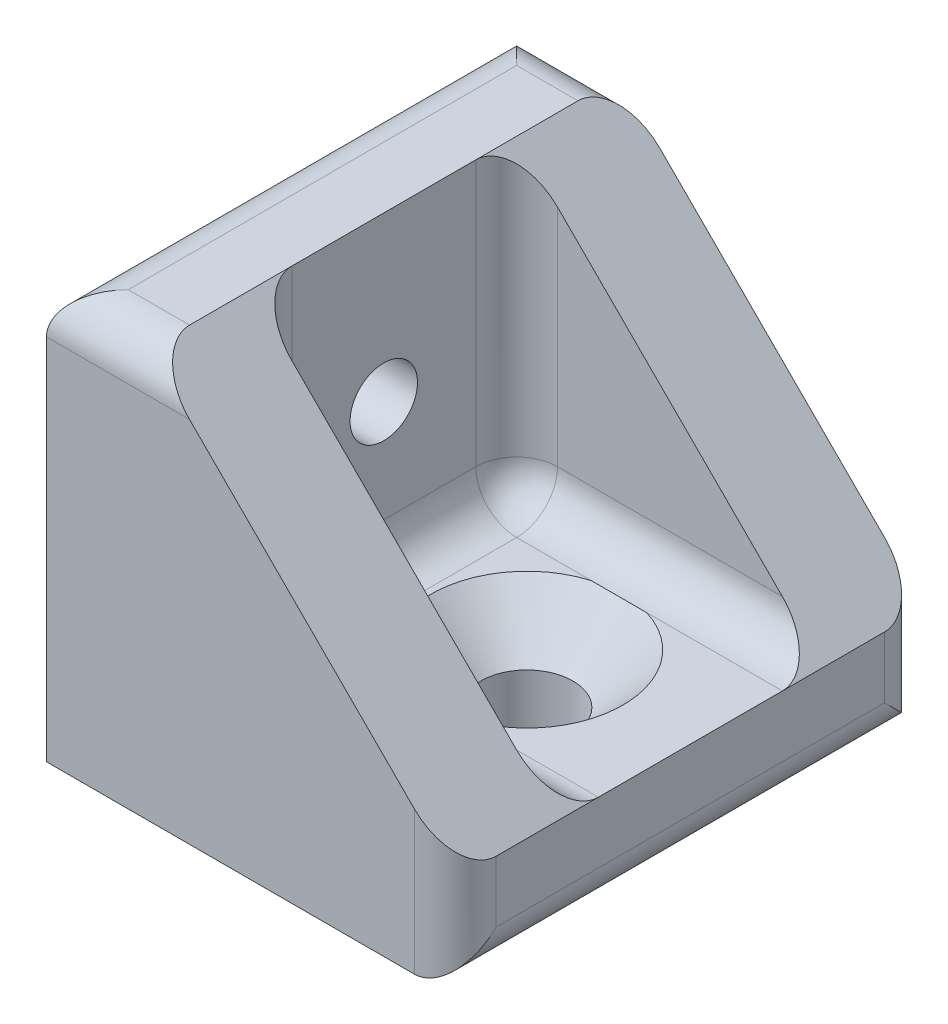
ISO-10303-21;
HEADER;
FILE_DESCRIPTION(('STEP AP214'),'2;1');
FILE_NAME('part.step','',(''),(''),'','','');
FILE_SCHEMA(('AUTOMOTIVE_DESIGN { 1 0 10303 214 1 1 1 1 }'));
ENDSEC;
DATA;
#1=APPLICATION_CONTEXT('core data for automotive mechanical design processes');
#2=APPLICATION_PROTOCOL_DEFINITION('international standard','automotive_design',2000,#1);
#3=PRODUCT_CONTEXT('',#1,'mechanical');
#4=PRODUCT('Part','Part','',(#3));
#5=PRODUCT_RELATED_PRODUCT_CATEGORY('part','',(#4));
#6=PRODUCT_DEFINITION_FORMATION('','',#4);
#7=PRODUCT_DEFINITION_CONTEXT('part definition',#1,'design');
#8=PRODUCT_DEFINITION('design','',#6,#7);
#9=PRODUCT_DEFINITION_SHAPE('','',#8);
#10=(LENGTH_UNIT() NAMED_UNIT(*) SI_UNIT(.MILLI.,.METRE.));
#11=(NAMED_UNIT(*) PLANE_ANGLE_UNIT() SI_UNIT($,.RADIAN.));
#12=(NAMED_UNIT(*) SI_UNIT($,.STERADIAN.) SOLID_ANGLE_UNIT());
#13=UNCERTAINTY_MEASURE_WITH_UNIT(LENGTH_MEASURE(1.E-05),#10,'distance_accuracy_value','');
#14=(GEOMETRIC_REPRESENTATION_CONTEXT(3) GLOBAL_UNCERTAINTY_ASSIGNED_CONTEXT((#13)) GLOBAL_UNIT_ASSIGNED_CONTEXT((#10,
#11,#12)) REPRESENTATION_CONTEXT('',''));
#15=CARTESIAN_POINT('',(0.,0.,0.));
#16=DIRECTION('',(0.,0.,1.));
#17=DIRECTION('',(1.,0.,0.));
#18=AXIS2_PLACEMENT_3D('',#15,#16,#17);
#19=CARTESIAN_POINT('',(20.,5.,-23.));
#20=DIRECTION('',(0.,-1.,0.));
#21=DIRECTION('',(0.,0.,-1.));
#22=AXIS2_PLACEMENT_3D('',#19,#20,#21);
#23=PLANE('',#22);
#24=CARTESIAN_POINT('',(12.,5.,-11.5));
#25=DIRECTION('',(0.,1.,0.));
#26=DIRECTION('',(0.,0.,1.));
#27=AXIS2_PLACEMENT_3D('',#24,#25,#26);
#28=CIRCLE('',#27,4.7);
#29=CARTESIAN_POINT('',(13.3564659966251,5.,-7.));
#30=VERTEX_POINT('',#29);
#31=CARTESIAN_POINT('',(13.356465996625,5.,-16.));
#32=VERTEX_POINT('',#31);
#33=EDGE_CURVE('E177',#30,#32,#28,.T.);
#34=ORIENTED_EDGE('',*,*,#33,.F.);
#35=DIRECTION('',(1.,0.,0.));
#36=VECTOR('',#35,1.);
#37=CARTESIAN_POINT('',(20.,5.,-7.));
#38=LINE('',#37,#36);
#39=CARTESIAN_POINT('',(20.,5.,-7.));
#40=VERTEX_POINT('',#39);
#41=EDGE_CURVE('E174',#30,#40,#38,.T.);
#42=ORIENTED_EDGE('',*,*,#41,.T.);
#43=DIRECTION('',(0.,0.,1.));
#44=VECTOR('',#43,1.);
#45=CARTESIAN_POINT('',(20.,5.,-23.));
#46=LINE('',#45,#44);
#47=CARTESIAN_POINT('',(20.,5.,-16.));
#48=VERTEX_POINT('',#47);
#49=EDGE_CURVE('E294',#48,#40,#46,.T.);
#50=ORIENTED_EDGE('',*,*,#49,.F.);
#51=DIRECTION('',(1.,0.,0.));
#52=VECTOR('',#51,1.);
#53=CARTESIAN_POINT('',(5.,5.,-16.));
#54=LINE('',#53,#52);
#55=EDGE_CURVE('E186',#48,#32,#54,.F.);
#56=ORIENTED_EDGE('',*,*,#55,.T.);
#57=EDGE_LOOP('',(#34,#42,#50,#56));
#58=FACE_BOUND('',#57,.T.);
#59=ADVANCED_FACE('F39',(#58),#23,.F.);
#60=CARTESIAN_POINT('',(10.643534003375,5.,-16.));
#61=VERTEX_POINT('',#60);
#62=CARTESIAN_POINT('',(10.6435340033749,5.,-7.));
#63=VERTEX_POINT('',#62);
#64=EDGE_CURVE('E185',#61,#63,#28,.T.);
#65=ORIENTED_EDGE('',*,*,#64,.F.);
#66=CARTESIAN_POINT('',(7.,5.,-16.));
#67=VERTEX_POINT('',#66);
#68=EDGE_CURVE('E198',#61,#67,#54,.F.);
#69=ORIENTED_EDGE('',*,*,#68,.T.);
#70=DIRECTION('',(0.,0.,1.));
#71=VECTOR('',#70,1.);
#72=CARTESIAN_POINT('',(7.,5.,-5.));
#73=LINE('',#72,#71);
#74=CARTESIAN_POINT('',(7.,5.,-7.));
#75=VERTEX_POINT('',#74);
#76=EDGE_CURVE('E192',#67,#75,#73,.T.);
#77=ORIENTED_EDGE('',*,*,#76,.T.);
#78=EDGE_CURVE('E172',#75,#63,#38,.T.);
#79=ORIENTED_EDGE('',*,*,#78,.T.);
#80=EDGE_LOOP('',(#65,#69,#77,#79));
#81=FACE_BOUND('',#80,.T.);
#82=ADVANCED_FACE('F413',(#81),#23,.F.);
#83=CARTESIAN_POINT('',(5.,20.,-23.));
#84=DIRECTION('',(0.707106781186548,0.707106781186548,0.));
#85=DIRECTION('',(-0.707106781186548,0.707106781186548,0.));
#86=AXIS2_PLACEMENT_3D('',#83,#84,#85);
#87=PLANE('',#86);
#88=DIRECTION('',(-0.707106781186547,0.707106781186547,0.));
#89=VECTOR('',#88,1.);
#90=CARTESIAN_POINT('',(5.,20.,0.));
#91=LINE('',#90,#89);
#92=CARTESIAN_POINT('',(18.,7.,0.));
#93=VERTEX_POINT('',#92);
#94=CARTESIAN_POINT('',(7.,18.,0.));
#95=VERTEX_POINT('',#94);
#96=EDGE_CURVE('E314',#93,#95,#91,.T.);
#97=ORIENTED_EDGE('',*,*,#96,.F.);
#98=CARTESIAN_POINT('',(18.,7.,-2.));
#99=DIRECTION('',(0.707106781186548,0.707106781186548,0.));
#100=DIRECTION('',(0.707106781186548,-0.707106781186548,0.));
#101=AXIS2_PLACEMENT_3D('',#98,#99,#100);
#102=ELLIPSE('',#101,2.82842712474619,2.);
#103=CARTESIAN_POINT('',(20.,5.,-2.));
#104=VERTEX_POINT('',#103);
#105=EDGE_CURVE('E270',#93,#104,#102,.T.);
#106=ORIENTED_EDGE('',*,*,#105,.T.);
#107=DIRECTION('',(0.,0.,1.));
#108=VECTOR('',#107,1.);
#109=CARTESIAN_POINT('',(20.,5.,-23.));
#110=LINE('',#109,#108);
#111=EDGE_CURVE('E315',#40,#104,#110,.T.);
#112=ORIENTED_EDGE('',*,*,#111,.F.);
#113=CARTESIAN_POINT('',(18.,7.,-7.));
#114=DIRECTION('',(0.707106781186548,0.707106781186548,0.));
#115=DIRECTION('',(0.707106781186548,-0.707106781186548,0.));
#116=AXIS2_PLACEMENT_3D('',#113,#114,#115);
#117=ELLIPSE('',#116,2.82842712474619,2.);
#118=CARTESIAN_POINT('',(18.,7.,-5.));
#119=VERTEX_POINT('',#118);
#120=EDGE_CURVE('E193',#40,#119,#117,.F.);
#121=ORIENTED_EDGE('',*,*,#120,.T.);
#122=DIRECTION('',(-0.707106781186548,0.707106781186548,0.));
#123=VECTOR('',#122,1.);
#124=CARTESIAN_POINT('',(5.,20.,-5.));
#125=LINE('',#124,#123);
#126=CARTESIAN_POINT('',(7.,18.,-5.));
#127=VERTEX_POINT('',#126);
#128=EDGE_CURVE('E239',#119,#127,#125,.T.);
#129=ORIENTED_EDGE('',*,*,#128,.T.);
#130=CARTESIAN_POINT('',(7.,18.,-7.));
#131=DIRECTION('',(0.707106781186548,0.707106781186548,0.));
#132=DIRECTION('',(0.707106781186548,-0.707106781186548,0.));
#133=AXIS2_PLACEMENT_3D('',#130,#131,#132);
#134=ELLIPSE('',#133,2.82842712474619,2.);
#135=CARTESIAN_POINT('',(5.,20.,-7.));
#136=VERTEX_POINT('',#135);
#137=EDGE_CURVE('E217',#127,#136,#134,.F.);
#138=ORIENTED_EDGE('',*,*,#137,.T.);
#139=DIRECTION('',(0.,0.,1.));
#140=VECTOR('',#139,1.);
#141=CARTESIAN_POINT('',(5.,20.,-23.));
#142=LINE('',#141,#140);
#143=CARTESIAN_POINT('',(5.,20.,-2.));
#144=VERTEX_POINT('',#143);
#145=EDGE_CURVE('E323',#136,#144,#142,.T.);
#146=ORIENTED_EDGE('',*,*,#145,.T.);
#147=CARTESIAN_POINT('',(7.,18.,-2.));
#148=DIRECTION('',(0.707106781186548,0.707106781186548,0.));
#149=DIRECTION('',(0.707106781186548,-0.707106781186548,0.));
#150=AXIS2_PLACEMENT_3D('',#147,#148,#149);
#151=ELLIPSE('',#150,2.82842712474619,2.);
#152=EDGE_CURVE('E265',#144,#95,#151,.T.);
#153=ORIENTED_EDGE('',*,*,#152,.T.);
#154=EDGE_LOOP('',(#97,#106,#112,#121,#129,#138,#146,#153));
#155=FACE_BOUND('',#154,.T.);
#156=ADVANCED_FACE('F390',(#155),#87,.T.);
#157=CARTESIAN_POINT('',(20.,0.,-23.));
#158=DIRECTION('',(0.,-1.,0.));
#159=DIRECTION('',(0.,0.,-1.));
#160=AXIS2_PLACEMENT_3D('',#157,#158,#159);
#161=PLANE('',#160);
#162=CARTESIAN_POINT('',(12.,0.,-11.5));
#163=DIRECTION('',(0.,1.,0.));
#164=DIRECTION('',(0.,0.,1.));
#165=AXIS2_PLACEMENT_3D('',#162,#163,#164);
#166=CIRCLE('',#165,2.25);
#167=CARTESIAN_POINT('',(12.,0.,-9.25));
#168=VERTEX_POINT('',#167);
#169=EDGE_CURVE('E290',#168,#168,#166,.T.);
#170=ORIENTED_EDGE('',*,*,#169,.T.);
#171=EDGE_LOOP('',(#170));
#172=FACE_BOUND('',#171,.T.);
#173=DIRECTION('',(1.,0.,0.));
#174=VECTOR('',#173,1.);
#175=CARTESIAN_POINT('',(20.,0.,-23.));
#176=LINE('',#175,#174);
#177=CARTESIAN_POINT('',(0.,0.,-23.));
#178=VERTEX_POINT('',#177);
#179=CARTESIAN_POINT('',(18.,0.,-23.));
#180=VERTEX_POINT('',#179);
#181=EDGE_CURVE('E303',#178,#180,#176,.T.);
#182=ORIENTED_EDGE('',*,*,#181,.T.);
#183=DIRECTION('',(0.,0.,1.));
#184=VECTOR('',#183,1.);
#185=CARTESIAN_POINT('',(18.,0.,-23.));
#186=LINE('',#185,#184);
#187=CARTESIAN_POINT('',(18.,0.,0.));
#188=VERTEX_POINT('',#187);
#189=EDGE_CURVE('E48',#180,#188,#186,.T.);
#190=ORIENTED_EDGE('',*,*,#189,.T.);
#191=DIRECTION('',(1.,0.,0.));
#192=VECTOR('',#191,1.);
#193=CARTESIAN_POINT('',(20.,0.,0.));
#194=LINE('',#193,#192);
#195=CARTESIAN_POINT('',(0.,0.,0.));
#196=VERTEX_POINT('',#195);
#197=EDGE_CURVE('E295',#196,#188,#194,.T.);
#198=ORIENTED_EDGE('',*,*,#197,.F.);
#199=DIRECTION('',(0.,0.,1.));
#200=VECTOR('',#199,1.);
#201=CARTESIAN_POINT('',(0.,0.,-23.));
#202=LINE('',#201,#200);
#203=EDGE_CURVE('E319',#178,#196,#202,.T.);
#204=ORIENTED_EDGE('',*,*,#203,.F.);
#205=EDGE_LOOP('',(#182,#190,#198,#204));
#206=FACE_BOUND('',#205,.T.);
#207=ADVANCED_FACE('F376',(#172,#206),#161,.T.);
#208=CARTESIAN_POINT('',(0.,0.,-23.));
#209=DIRECTION('',(-1.,0.,0.));
#210=DIRECTION('',(0.,0.,1.));
#211=AXIS2_PLACEMENT_3D('',#208,#209,#210);
#212=PLANE('',#211);
#213=CARTESIAN_POINT('',(0.,12.,-11.5));
#214=DIRECTION('',(1.,0.,0.));
#215=DIRECTION('',(0.,0.,-1.));
#216=AXIS2_PLACEMENT_3D('',#213,#214,#215);
#217=CIRCLE('',#216,1.65);
#218=CARTESIAN_POINT('',(0.,12.,-13.15));
#219=VERTEX_POINT('',#218);
#220=EDGE_CURVE('E273',#219,#219,#217,.T.);
#221=ORIENTED_EDGE('',*,*,#220,.T.);
#222=EDGE_LOOP('',(#221));
#223=FACE_BOUND('',#222,.T.);
#224=DIRECTION('',(0.,-1.,0.));
#225=VECTOR('',#224,1.);
#226=CARTESIAN_POINT('',(0.,0.,0.));
#227=LINE('',#226,#225);
#228=CARTESIAN_POINT('',(0.,18.,0.));
#229=VERTEX_POINT('',#228);
#230=EDGE_CURVE('E310',#229,#196,#227,.T.);
#231=ORIENTED_EDGE('',*,*,#230,.F.);
#232=DIRECTION('',(0.,0.,1.));
#233=VECTOR('',#232,1.);
#234=CARTESIAN_POINT('',(0.,18.,-23.));
#235=LINE('',#234,#233);
#236=CARTESIAN_POINT('',(0.,18.,-23.));
#237=VERTEX_POINT('',#236);
#238=EDGE_CURVE('E11',#229,#237,#235,.F.);
#239=ORIENTED_EDGE('',*,*,#238,.T.);
#240=DIRECTION('',(0.,-1.,0.));
#241=VECTOR('',#240,1.);
#242=CARTESIAN_POINT('',(0.,0.,-23.));
#243=LINE('',#242,#241);
#244=EDGE_CURVE('E309',#237,#178,#243,.T.);
#245=ORIENTED_EDGE('',*,*,#244,.T.);
#246=ORIENTED_EDGE('',*,*,#203,.T.);
#247=EDGE_LOOP('',(#231,#239,#245,#246));
#248=FACE_BOUND('',#247,.T.);
#249=ADVANCED_FACE('F399',(#223,#248),#212,.T.);
#250=CARTESIAN_POINT('',(0.,20.,-23.));
#251=DIRECTION('',(0.,1.,0.));
#252=DIRECTION('',(0.,0.,1.));
#253=AXIS2_PLACEMENT_3D('',#250,#251,#252);
#254=PLANE('',#253);
#255=CARTESIAN_POINT('',(5.,20.,-21.));
#256=VERTEX_POINT('',#255);
#257=CARTESIAN_POINT('',(5.,20.,-16.));
#258=VERTEX_POINT('',#257);
#259=EDGE_CURVE('E321',#256,#258,#142,.T.);
#260=ORIENTED_EDGE('',*,*,#259,.F.);
#261=DIRECTION('',(-1.,0.,0.));
#262=VECTOR('',#261,1.);
#263=CARTESIAN_POINT('',(0.,20.,-21.));
#264=LINE('',#263,#262);
#265=CARTESIAN_POINT('',(2.,20.,-21.));
#266=VERTEX_POINT('',#265);
#267=EDGE_CURVE('E242',#256,#266,#264,.T.);
#268=ORIENTED_EDGE('',*,*,#267,.T.);
#269=DIRECTION('',(0.,0.,1.));
#270=VECTOR('',#269,1.);
#271=CARTESIAN_POINT('',(2.,20.,-23.));
#272=LINE('',#271,#270);
#273=CARTESIAN_POINT('',(2.,20.,-2.));
#274=VERTEX_POINT('',#273);
#275=EDGE_CURVE('E221',#266,#274,#272,.T.);
#276=ORIENTED_EDGE('',*,*,#275,.T.);
#277=DIRECTION('',(-1.,0.,0.));
#278=VECTOR('',#277,1.);
#279=CARTESIAN_POINT('',(5.,20.,-2.));
#280=LINE('',#279,#278);
#281=EDGE_CURVE('E245',#274,#144,#280,.F.);
#282=ORIENTED_EDGE('',*,*,#281,.T.);
#283=ORIENTED_EDGE('',*,*,#145,.F.);
#284=DIRECTION('',(0.,0.,1.));
#285=VECTOR('',#284,1.);
#286=CARTESIAN_POINT('',(5.,20.,-23.));
#287=LINE('',#286,#285);
#288=EDGE_CURVE('E293',#258,#136,#287,.T.);
#289=ORIENTED_EDGE('',*,*,#288,.F.);
#290=EDGE_LOOP('',(#260,#268,#276,#282,#283,#289));
#291=FACE_BOUND('',#290,.T.);
#292=ADVANCED_FACE('F347',(#291),#254,.T.);
#293=DIRECTION('',(-0.707106781186547,0.707106781186547,0.));
#294=VECTOR('',#293,1.);
#295=CARTESIAN_POINT('',(5.,20.,-23.));
#296=LINE('',#295,#294);
#297=CARTESIAN_POINT('',(18.,7.,-23.));
#298=VERTEX_POINT('',#297);
#299=CARTESIAN_POINT('',(7.,18.,-23.));
#300=VERTEX_POINT('',#299);
#301=EDGE_CURVE('E306',#298,#300,#296,.T.);
#302=ORIENTED_EDGE('',*,*,#301,.T.);
#303=CARTESIAN_POINT('',(7.,18.,-21.));
#304=DIRECTION('',(0.707106781186548,0.707106781186548,0.));
#305=DIRECTION('',(-0.707106781186548,0.707106781186548,0.));
#306=AXIS2_PLACEMENT_3D('',#303,#304,#305);
#307=ELLIPSE('',#306,2.82842712474619,2.);
#308=EDGE_CURVE('E254',#300,#256,#307,.T.);
#309=ORIENTED_EDGE('',*,*,#308,.T.);
#310=ORIENTED_EDGE('',*,*,#259,.T.);
#311=CARTESIAN_POINT('',(7.,18.,-16.));
#312=DIRECTION('',(0.707106781186548,0.707106781186548,0.));
#313=DIRECTION('',(-0.707106781186548,0.707106781186548,0.));
#314=AXIS2_PLACEMENT_3D('',#311,#312,#313);
#315=ELLIPSE('',#314,2.82842712474619,2.);
#316=CARTESIAN_POINT('',(7.,18.,-18.));
#317=VERTEX_POINT('',#316);
#318=EDGE_CURVE('E208',#258,#317,#315,.F.);
#319=ORIENTED_EDGE('',*,*,#318,.T.);
#320=DIRECTION('',(-0.707106781186548,0.707106781186548,0.));
#321=VECTOR('',#320,1.);
#322=CARTESIAN_POINT('',(5.,20.,-18.));
#323=LINE('',#322,#321);
#324=CARTESIAN_POINT('',(18.,7.,-18.));
#325=VERTEX_POINT('',#324);
#326=EDGE_CURVE('E296',#325,#317,#323,.T.);
#327=ORIENTED_EDGE('',*,*,#326,.F.);
#328=CARTESIAN_POINT('',(18.,7.,-16.));
#329=DIRECTION('',(0.707106781186548,0.707106781186548,0.));
#330=DIRECTION('',(-0.707106781186548,0.707106781186548,0.));
#331=AXIS2_PLACEMENT_3D('',#328,#329,#330);
#332=ELLIPSE('',#331,2.82842712474619,2.);
#333=EDGE_CURVE('E213',#325,#48,#332,.F.);
#334=ORIENTED_EDGE('',*,*,#333,.T.);
#335=CARTESIAN_POINT('',(20.,5.,-21.));
#336=VERTEX_POINT('',#335);
#337=EDGE_CURVE('E322',#336,#48,#110,.T.);
#338=ORIENTED_EDGE('',*,*,#337,.F.);
#339=CARTESIAN_POINT('',(18.,7.,-21.));
#340=DIRECTION('',(0.707106781186548,0.707106781186548,0.));
#341=DIRECTION('',(-0.707106781186548,0.707106781186548,0.));
#342=AXIS2_PLACEMENT_3D('',#339,#340,#341);
#343=ELLIPSE('',#342,2.82842712474619,2.);
#344=EDGE_CURVE('E252',#336,#298,#343,.T.);
#345=ORIENTED_EDGE('',*,*,#344,.T.);
#346=EDGE_LOOP('',(#302,#309,#310,#319,#327,#334,#338,#345));
#347=FACE_BOUND('',#346,.T.);
#348=ADVANCED_FACE('F353',(#347),#87,.T.);
#349=CARTESIAN_POINT('',(20.,5.,-23.));
#350=DIRECTION('',(1.,0.,0.));
#351=DIRECTION('',(0.,0.,-1.));
#352=AXIS2_PLACEMENT_3D('',#349,#350,#351);
#353=PLANE('',#352);
#354=DIRECTION('',(0.,0.,1.));
#355=VECTOR('',#354,1.);
#356=CARTESIAN_POINT('',(20.,2.,-23.));
#357=LINE('',#356,#355);
#358=CARTESIAN_POINT('',(20.,2.,-2.));
#359=VERTEX_POINT('',#358);
#360=CARTESIAN_POINT('',(20.,2.,-21.));
#361=VERTEX_POINT('',#360);
#362=EDGE_CURVE('E253',#359,#361,#357,.F.);
#363=ORIENTED_EDGE('',*,*,#362,.T.);
#364=DIRECTION('',(0.,1.,0.));
#365=VECTOR('',#364,1.);
#366=CARTESIAN_POINT('',(20.,5.,-21.));
#367=LINE('',#366,#365);
#368=EDGE_CURVE('E258',#361,#336,#367,.T.);
#369=ORIENTED_EDGE('',*,*,#368,.T.);
#370=ORIENTED_EDGE('',*,*,#337,.T.);
#371=ORIENTED_EDGE('',*,*,#49,.T.);
#372=ORIENTED_EDGE('',*,*,#111,.T.);
#373=DIRECTION('',(0.,1.,0.));
#374=VECTOR('',#373,1.);
#375=CARTESIAN_POINT('',(20.,0.,-2.));
#376=LINE('',#375,#374);
#377=EDGE_CURVE('E256',#104,#359,#376,.F.);
#378=ORIENTED_EDGE('',*,*,#377,.T.);
#379=EDGE_LOOP('',(#363,#369,#370,#371,#372,#378));
#380=FACE_BOUND('',#379,.T.);
#381=ADVANCED_FACE('F362',(#380),#353,.T.);
#382=CARTESIAN_POINT('',(0.,0.,-23.));
#383=DIRECTION('',(0.,0.,-1.));
#384=DIRECTION('',(-1.,0.,0.));
#385=AXIS2_PLACEMENT_3D('',#382,#383,#384);
#386=PLANE('',#385);
#387=ORIENTED_EDGE('',*,*,#244,.F.);
#388=DIRECTION('',(-1.,0.,0.));
#389=VECTOR('',#388,1.);
#390=CARTESIAN_POINT('',(0.,18.,-23.));
#391=LINE('',#390,#389);
#392=EDGE_CURVE('E248',#237,#300,#391,.F.);
#393=ORIENTED_EDGE('',*,*,#392,.T.);
#394=ORIENTED_EDGE('',*,*,#301,.F.);
#395=DIRECTION('',(0.,1.,0.));
#396=VECTOR('',#395,1.);
#397=CARTESIAN_POINT('',(18.,0.,-23.));
#398=LINE('',#397,#396);
#399=EDGE_CURVE('E250',#298,#180,#398,.F.);
#400=ORIENTED_EDGE('',*,*,#399,.T.);
#401=ORIENTED_EDGE('',*,*,#181,.F.);
#402=EDGE_LOOP('',(#387,#393,#394,#400,#401));
#403=FACE_BOUND('',#402,.T.);
#404=ADVANCED_FACE('F375',(#403),#386,.T.);
#405=CARTESIAN_POINT('',(0.,0.,0.));
#406=DIRECTION('',(0.,0.,-1.));
#407=DIRECTION('',(-1.,0.,0.));
#408=AXIS2_PLACEMENT_3D('',#405,#406,#407);
#409=PLANE('',#408);
#410=ORIENTED_EDGE('',*,*,#197,.T.);
#411=DIRECTION('',(0.,1.,0.));
#412=VECTOR('',#411,1.);
#413=CARTESIAN_POINT('',(18.,5.,0.));
#414=LINE('',#413,#412);
#415=EDGE_CURVE('E264',#188,#93,#414,.T.);
#416=ORIENTED_EDGE('',*,*,#415,.T.);
#417=ORIENTED_EDGE('',*,*,#96,.T.);
#418=DIRECTION('',(-1.,0.,0.));
#419=VECTOR('',#418,1.);
#420=CARTESIAN_POINT('',(0.,18.,0.));
#421=LINE('',#420,#419);
#422=EDGE_CURVE('E63',#95,#229,#421,.T.);
#423=ORIENTED_EDGE('',*,*,#422,.T.);
#424=ORIENTED_EDGE('',*,*,#230,.T.);
#425=EDGE_LOOP('',(#410,#416,#417,#423,#424));
#426=FACE_BOUND('',#425,.T.);
#427=ADVANCED_FACE('F389',(#426),#409,.F.);
#428=CARTESIAN_POINT('',(5.,0.,-23.));
#429=DIRECTION('',(-1.,0.,0.));
#430=DIRECTION('',(0.,0.,1.));
#431=AXIS2_PLACEMENT_3D('',#428,#429,#430);
#432=PLANE('',#431);
#433=CARTESIAN_POINT('',(5.,12.,-11.5));
#434=DIRECTION('',(1.,0.,0.));
#435=DIRECTION('',(0.,0.,-1.));
#436=AXIS2_PLACEMENT_3D('',#433,#434,#435);
#437=CIRCLE('',#436,1.65);
#438=CARTESIAN_POINT('',(5.,12.,-13.15));
#439=VERTEX_POINT('',#438);
#440=EDGE_CURVE('E282',#439,#439,#437,.T.);
#441=ORIENTED_EDGE('',*,*,#440,.F.);
#442=EDGE_LOOP('',(#441));
#443=FACE_BOUND('',#442,.T.);
#444=DIRECTION('',(0.,0.,1.));
#445=VECTOR('',#444,1.);
#446=CARTESIAN_POINT('',(5.,7.,-18.));
#447=LINE('',#446,#445);
#448=CARTESIAN_POINT('',(5.,7.,-7.));
#449=VERTEX_POINT('',#448);
#450=CARTESIAN_POINT('',(5.,7.,-16.));
#451=VERTEX_POINT('',#450);
#452=EDGE_CURVE('E331',#449,#451,#447,.F.);
#453=ORIENTED_EDGE('',*,*,#452,.T.);
#454=DIRECTION('',(0.,-1.,0.));
#455=VECTOR('',#454,1.);
#456=CARTESIAN_POINT('',(5.,20.,-16.));
#457=LINE('',#456,#455);
#458=EDGE_CURVE('E196',#451,#258,#457,.F.);
#459=ORIENTED_EDGE('',*,*,#458,.T.);
#460=ORIENTED_EDGE('',*,*,#288,.T.);
#461=DIRECTION('',(0.,-1.,0.));
#462=VECTOR('',#461,1.);
#463=CARTESIAN_POINT('',(5.,0.,-7.));
#464=LINE('',#463,#462);
#465=EDGE_CURVE('E332',#136,#449,#464,.T.);
#466=ORIENTED_EDGE('',*,*,#465,.T.);
#467=EDGE_LOOP('',(#453,#459,#460,#466));
#468=FACE_BOUND('',#467,.T.);
#469=ADVANCED_FACE('F339',(#443,#468),#432,.F.);
#470=CARTESIAN_POINT('',(0.,0.,-18.));
#471=DIRECTION('',(0.,0.,-1.));
#472=DIRECTION('',(-1.,0.,0.));
#473=AXIS2_PLACEMENT_3D('',#470,#471,#472);
#474=PLANE('',#473);
#475=ORIENTED_EDGE('',*,*,#326,.T.);
#476=DIRECTION('',(0.,-1.,0.));
#477=VECTOR('',#476,1.);
#478=CARTESIAN_POINT('',(7.,5.,-18.));
#479=LINE('',#478,#477);
#480=CARTESIAN_POINT('',(7.,7.,-18.));
#481=VERTEX_POINT('',#480);
#482=EDGE_CURVE('E329',#317,#481,#479,.T.);
#483=ORIENTED_EDGE('',*,*,#482,.T.);
#484=DIRECTION('',(1.,0.,0.));
#485=VECTOR('',#484,1.);
#486=CARTESIAN_POINT('',(20.,7.,-18.));
#487=LINE('',#486,#485);
#488=EDGE_CURVE('E324',#481,#325,#487,.T.);
#489=ORIENTED_EDGE('',*,*,#488,.T.);
#490=EDGE_LOOP('',(#475,#483,#489));
#491=FACE_BOUND('',#490,.T.);
#492=ADVANCED_FACE('F357',(#491),#474,.F.);
#493=CARTESIAN_POINT('',(0.,0.,-5.));
#494=DIRECTION('',(0.,0.,-1.));
#495=DIRECTION('',(-1.,0.,0.));
#496=AXIS2_PLACEMENT_3D('',#493,#494,#495);
#497=PLANE('',#496);
#498=DIRECTION('',(1.,0.,0.));
#499=VECTOR('',#498,1.);
#500=CARTESIAN_POINT('',(0.,7.,-5.));
#501=LINE('',#500,#499);
#502=CARTESIAN_POINT('',(7.,7.,-5.));
#503=VERTEX_POINT('',#502);
#504=EDGE_CURVE('E204',#119,#503,#501,.F.);
#505=ORIENTED_EDGE('',*,*,#504,.T.);
#506=DIRECTION('',(0.,-1.,0.));
#507=VECTOR('',#506,1.);
#508=CARTESIAN_POINT('',(7.,0.,-5.));
#509=LINE('',#508,#507);
#510=EDGE_CURVE('E207',#503,#127,#509,.F.);
#511=ORIENTED_EDGE('',*,*,#510,.T.);
#512=ORIENTED_EDGE('',*,*,#128,.F.);
#513=EDGE_LOOP('',(#505,#511,#512));
#514=FACE_BOUND('',#513,.T.);
#515=ADVANCED_FACE('F429',(#514),#497,.T.);
#516=CARTESIAN_POINT('',(20.,7.,-7.));
#517=DIRECTION('',(1.,0.,0.));
#518=DIRECTION('',(0.,0.,-1.));
#519=AXIS2_PLACEMENT_3D('',#516,#517,#518);
#520=CYLINDRICAL_SURFACE('',#519,2.);
#521=ORIENTED_EDGE('',*,*,#120,.F.);
#522=ORIENTED_EDGE('',*,*,#41,.F.);
#523=EDGE_CURVE('E168',#63,#30,#38,.T.);
#524=ORIENTED_EDGE('',*,*,#523,.F.);
#525=ORIENTED_EDGE('',*,*,#78,.F.);
#526=CARTESIAN_POINT('',(7.,7.,-7.));
#527=DIRECTION('',(1.,0.,0.));
#528=DIRECTION('',(0.,1.,0.));
#529=AXIS2_PLACEMENT_3D('',#526,#527,#528);
#530=CIRCLE('',#529,2.);
#531=EDGE_CURVE('E240',#503,#75,#530,.T.);
#532=ORIENTED_EDGE('',*,*,#531,.F.);
#533=ORIENTED_EDGE('',*,*,#504,.F.);
#534=EDGE_LOOP('',(#521,#522,#524,#525,#532,#533));
#535=FACE_BOUND('',#534,.T.);
#536=ADVANCED_FACE('F191',(#535),#520,.F.);
#537=CARTESIAN_POINT('',(7.,0.,-7.));
#538=DIRECTION('',(0.,-1.,0.));
#539=DIRECTION('',(0.,0.,-1.));
#540=AXIS2_PLACEMENT_3D('',#537,#538,#539);
#541=CYLINDRICAL_SURFACE('',#540,2.);
#542=ORIENTED_EDGE('',*,*,#137,.F.);
#543=ORIENTED_EDGE('',*,*,#510,.F.);
#544=CARTESIAN_POINT('',(7.,7.,-7.));
#545=DIRECTION('',(0.,1.,0.));
#546=DIRECTION('',(0.,0.,1.));
#547=AXIS2_PLACEMENT_3D('',#544,#545,#546);
#548=CIRCLE('',#547,2.);
#549=EDGE_CURVE('E234',#449,#503,#548,.T.);
#550=ORIENTED_EDGE('',*,*,#549,.F.);
#551=ORIENTED_EDGE('',*,*,#465,.F.);
#552=EDGE_LOOP('',(#542,#543,#550,#551));
#553=FACE_BOUND('',#552,.T.);
#554=ADVANCED_FACE('F465',(#553),#541,.F.);
#555=CARTESIAN_POINT('',(7.,7.,-7.));
#556=DIRECTION('',(0.,0.,1.));
#557=DIRECTION('',(1.,0.,0.));
#558=AXIS2_PLACEMENT_3D('',#555,#556,#557);
#559=SPHERICAL_SURFACE('',#558,2.);
#560=ORIENTED_EDGE('',*,*,#549,.T.);
#561=ORIENTED_EDGE('',*,*,#531,.T.);
#562=CARTESIAN_POINT('',(7.,7.,-7.));
#563=DIRECTION('',(0.,0.,-1.));
#564=DIRECTION('',(-1.,0.,0.));
#565=AXIS2_PLACEMENT_3D('',#562,#563,#564);
#566=CIRCLE('',#565,2.);
#567=EDGE_CURVE('E233',#449,#75,#566,.F.);
#568=ORIENTED_EDGE('',*,*,#567,.F.);
#569=EDGE_LOOP('',(#560,#561,#568));
#570=FACE_BOUND('',#569,.T.);
#571=ADVANCED_FACE('F458',(#570),#559,.F.);
#572=CARTESIAN_POINT('',(0.,7.,-16.));
#573=DIRECTION('',(-1.,0.,0.));
#574=DIRECTION('',(0.,0.,1.));
#575=AXIS2_PLACEMENT_3D('',#572,#573,#574);
#576=CYLINDRICAL_SURFACE('',#575,2.);
#577=ORIENTED_EDGE('',*,*,#333,.F.);
#578=ORIENTED_EDGE('',*,*,#488,.F.);
#579=CARTESIAN_POINT('',(7.,7.,-16.));
#580=DIRECTION('',(1.,0.,0.));
#581=DIRECTION('',(0.,0.,-1.));
#582=AXIS2_PLACEMENT_3D('',#579,#580,#581);
#583=CIRCLE('',#582,2.);
#584=EDGE_CURVE('E226',#67,#481,#583,.T.);
#585=ORIENTED_EDGE('',*,*,#584,.F.);
#586=ORIENTED_EDGE('',*,*,#68,.F.);
#587=EDGE_CURVE('E201',#32,#61,#54,.F.);
#588=ORIENTED_EDGE('',*,*,#587,.F.);
#589=ORIENTED_EDGE('',*,*,#55,.F.);
#590=EDGE_LOOP('',(#577,#578,#585,#586,#588,#589));
#591=FACE_BOUND('',#590,.T.);
#592=ADVANCED_FACE('F363',(#591),#576,.F.);
#593=CARTESIAN_POINT('',(7.,7.,-23.));
#594=DIRECTION('',(0.,0.,-1.));
#595=DIRECTION('',(-1.,0.,0.));
#596=AXIS2_PLACEMENT_3D('',#593,#594,#595);
#597=CYLINDRICAL_SURFACE('',#596,2.);
#598=ORIENTED_EDGE('',*,*,#567,.T.);
#599=ORIENTED_EDGE('',*,*,#76,.F.);
#600=CARTESIAN_POINT('',(7.,7.,-16.));
#601=DIRECTION('',(0.,0.,1.));
#602=DIRECTION('',(1.,0.,0.));
#603=AXIS2_PLACEMENT_3D('',#600,#601,#602);
#604=CIRCLE('',#603,2.);
#605=EDGE_CURVE('E223',#451,#67,#604,.T.);
#606=ORIENTED_EDGE('',*,*,#605,.F.);
#607=ORIENTED_EDGE('',*,*,#452,.F.);
#608=EDGE_LOOP('',(#598,#599,#606,#607));
#609=FACE_BOUND('',#608,.T.);
#610=ADVANCED_FACE('F451',(#609),#597,.F.);
#611=CARTESIAN_POINT('',(7.,7.,-16.));
#612=DIRECTION('',(0.,-1.,0.));
#613=DIRECTION('',(1.,0.,0.));
#614=AXIS2_PLACEMENT_3D('',#611,#612,#613);
#615=SPHERICAL_SURFACE('',#614,2.);
#616=ORIENTED_EDGE('',*,*,#605,.T.);
#617=ORIENTED_EDGE('',*,*,#584,.T.);
#618=CARTESIAN_POINT('',(7.,7.,-16.));
#619=DIRECTION('',(0.,1.,0.));
#620=DIRECTION('',(0.,0.,1.));
#621=AXIS2_PLACEMENT_3D('',#618,#619,#620);
#622=CIRCLE('',#621,2.);
#623=EDGE_CURVE('E225',#451,#481,#622,.F.);
#624=ORIENTED_EDGE('',*,*,#623,.F.);
#625=EDGE_LOOP('',(#616,#617,#624));
#626=FACE_BOUND('',#625,.T.);
#627=ADVANCED_FACE('F446',(#626),#615,.F.);
#628=CARTESIAN_POINT('',(7.,0.,-16.));
#629=DIRECTION('',(0.,1.,0.));
#630=DIRECTION('',(0.,0.,1.));
#631=AXIS2_PLACEMENT_3D('',#628,#629,#630);
#632=CYLINDRICAL_SURFACE('',#631,2.);
#633=ORIENTED_EDGE('',*,*,#318,.F.);
#634=ORIENTED_EDGE('',*,*,#458,.F.);
#635=ORIENTED_EDGE('',*,*,#623,.T.);
#636=ORIENTED_EDGE('',*,*,#482,.F.);
#637=EDGE_LOOP('',(#633,#634,#635,#636));
#638=FACE_BOUND('',#637,.T.);
#639=ADVANCED_FACE('F351',(#638),#632,.F.);
#640=CARTESIAN_POINT('',(0.,18.,-2.));
#641=DIRECTION('',(1.,0.,0.));
#642=DIRECTION('',(0.,0.,-1.));
#643=AXIS2_PLACEMENT_3D('',#640,#641,#642);
#644=CYLINDRICAL_SURFACE('',#643,2.);
#645=ORIENTED_EDGE('',*,*,#152,.F.);
#646=ORIENTED_EDGE('',*,*,#281,.F.);
#647=CARTESIAN_POINT('',(2.,18.,-2.));
#648=DIRECTION('',(0.707106781186547,0.,0.707106781186547));
#649=DIRECTION('',(-0.707106781186547,0.,0.707106781186547));
#650=AXIS2_PLACEMENT_3D('',#647,#648,#649);
#651=ELLIPSE('',#650,2.82842712474619,2.);
#652=EDGE_CURVE('E224',#229,#274,#651,.F.);
#653=ORIENTED_EDGE('',*,*,#652,.F.);
#654=ORIENTED_EDGE('',*,*,#422,.F.);
#655=EDGE_LOOP('',(#645,#646,#653,#654));
#656=FACE_BOUND('',#655,.T.);
#657=ADVANCED_FACE('F392',(#656),#644,.T.);
#658=CARTESIAN_POINT('',(2.,18.,-23.));
#659=DIRECTION('',(0.,0.,1.));
#660=DIRECTION('',(1.,0.,0.));
#661=AXIS2_PLACEMENT_3D('',#658,#659,#660);
#662=CYLINDRICAL_SURFACE('',#661,2.);
#663=ORIENTED_EDGE('',*,*,#652,.T.);
#664=ORIENTED_EDGE('',*,*,#275,.F.);
#665=CARTESIAN_POINT('',(2.,18.,-21.));
#666=DIRECTION('',(-0.707106781186547,0.,0.707106781186547));
#667=DIRECTION('',(0.707106781186547,0.,0.707106781186547));
#668=AXIS2_PLACEMENT_3D('',#665,#666,#667);
#669=ELLIPSE('',#668,2.82842712474619,2.);
#670=EDGE_CURVE('E269',#237,#266,#669,.F.);
#671=ORIENTED_EDGE('',*,*,#670,.F.);
#672=ORIENTED_EDGE('',*,*,#238,.F.);
#673=EDGE_LOOP('',(#663,#664,#671,#672));
#674=FACE_BOUND('',#673,.T.);
#675=ADVANCED_FACE('F397',(#674),#662,.T.);
#676=CARTESIAN_POINT('',(0.,18.,-21.));
#677=DIRECTION('',(-1.,0.,0.));
#678=DIRECTION('',(0.,0.,1.));
#679=AXIS2_PLACEMENT_3D('',#676,#677,#678);
#680=CYLINDRICAL_SURFACE('',#679,2.);
#681=ORIENTED_EDGE('',*,*,#308,.F.);
#682=ORIENTED_EDGE('',*,*,#392,.F.);
#683=ORIENTED_EDGE('',*,*,#670,.T.);
#684=ORIENTED_EDGE('',*,*,#267,.F.);
#685=EDGE_LOOP('',(#681,#682,#683,#684));
#686=FACE_BOUND('',#685,.T.);
#687=ADVANCED_FACE('F404',(#686),#680,.T.);
#688=CARTESIAN_POINT('',(18.,0.,-2.));
#689=DIRECTION('',(0.,-1.,0.));
#690=DIRECTION('',(0.,0.,-1.));
#691=AXIS2_PLACEMENT_3D('',#688,#689,#690);
#692=CYLINDRICAL_SURFACE('',#691,2.);
#693=ORIENTED_EDGE('',*,*,#105,.F.);
#694=ORIENTED_EDGE('',*,*,#415,.F.);
#695=CARTESIAN_POINT('',(18.,2.,-2.));
#696=DIRECTION('',(0.,0.707106781186547,0.707106781186547));
#697=DIRECTION('',(0.,-0.707106781186547,0.707106781186547));
#698=AXIS2_PLACEMENT_3D('',#695,#696,#697);
#699=ELLIPSE('',#698,2.82842712474619,2.);
#700=EDGE_CURVE('E43',#359,#188,#699,.F.);
#701=ORIENTED_EDGE('',*,*,#700,.F.);
#702=ORIENTED_EDGE('',*,*,#377,.F.);
#703=EDGE_LOOP('',(#693,#694,#701,#702));
#704=FACE_BOUND('',#703,.T.);
#705=ADVANCED_FACE('F41',(#704),#692,.T.);
#706=CARTESIAN_POINT('',(18.,2.,-23.));
#707=DIRECTION('',(0.,0.,1.));
#708=DIRECTION('',(1.,0.,0.));
#709=AXIS2_PLACEMENT_3D('',#706,#707,#708);
#710=CYLINDRICAL_SURFACE('',#709,2.);
#711=ORIENTED_EDGE('',*,*,#700,.T.);
#712=ORIENTED_EDGE('',*,*,#189,.F.);
#713=CARTESIAN_POINT('',(18.,2.,-21.));
#714=DIRECTION('',(0.,-0.707106781186547,0.707106781186547));
#715=DIRECTION('',(0.,0.707106781186547,0.707106781186547));
#716=AXIS2_PLACEMENT_3D('',#713,#714,#715);
#717=ELLIPSE('',#716,2.82842712474619,2.);
#718=EDGE_CURVE('E271',#361,#180,#717,.F.);
#719=ORIENTED_EDGE('',*,*,#718,.F.);
#720=ORIENTED_EDGE('',*,*,#362,.F.);
#721=EDGE_LOOP('',(#711,#712,#719,#720));
#722=FACE_BOUND('',#721,.T.);
#723=ADVANCED_FACE('F378',(#722),#710,.T.);
#724=CARTESIAN_POINT('',(18.,5.,-21.));
#725=DIRECTION('',(0.,1.,0.));
#726=DIRECTION('',(0.,0.,1.));
#727=AXIS2_PLACEMENT_3D('',#724,#725,#726);
#728=CYLINDRICAL_SURFACE('',#727,2.);
#729=ORIENTED_EDGE('',*,*,#718,.T.);
#730=ORIENTED_EDGE('',*,*,#399,.F.);
#731=ORIENTED_EDGE('',*,*,#344,.F.);
#732=ORIENTED_EDGE('',*,*,#368,.F.);
#733=EDGE_LOOP('',(#729,#730,#731,#732));
#734=FACE_BOUND('',#733,.T.);
#735=ADVANCED_FACE('F368',(#734),#728,.T.);
#736=CARTESIAN_POINT('',(5.,12.,-11.5));
#737=DIRECTION('',(1.,0.,0.));
#738=DIRECTION('',(0.,0.,-1.));
#739=AXIS2_PLACEMENT_3D('',#736,#737,#738);
#740=CYLINDRICAL_SURFACE('',#739,1.65);
#741=ORIENTED_EDGE('',*,*,#220,.F.);
#742=EDGE_LOOP('',(#741));
#743=FACE_BOUND('',#742,.T.);
#744=ORIENTED_EDGE('',*,*,#440,.T.);
#745=EDGE_LOOP('',(#744));
#746=FACE_BOUND('',#745,.T.);
#747=ADVANCED_FACE('F422',(#743,#746),#740,.F.);
#748=CARTESIAN_POINT('',(16.7,5.,-11.5));
#749=DIRECTION('',(0.,1.,0.));
#750=DIRECTION('',(0.,0.,1.));
#751=AXIS2_PLACEMENT_3D('',#748,#749,#750);
#752=PLANE('',#751);
#753=EDGE_CURVE('E169',#63,#30,#28,.T.);
#754=ORIENTED_EDGE('',*,*,#753,.F.);
#755=ORIENTED_EDGE('',*,*,#523,.T.);
#756=EDGE_LOOP('',(#754,#755));
#757=FACE_BOUND('',#756,.T.);
#758=ADVANCED_FACE('F166',(#757),#752,.F.);
#759=EDGE_CURVE('E57',#32,#61,#28,.T.);
#760=ORIENTED_EDGE('',*,*,#759,.F.);
#761=ORIENTED_EDGE('',*,*,#587,.T.);
#762=EDGE_LOOP('',(#760,#761));
#763=FACE_BOUND('',#762,.T.);
#764=ADVANCED_FACE('F487',(#763),#752,.F.);
#765=CARTESIAN_POINT('',(12.,5.,-11.5));
#766=DIRECTION('',(0.,1.,0.));
#767=DIRECTION('',(0.,0.,1.));
#768=AXIS2_PLACEMENT_3D('',#765,#766,#767);
#769=CYLINDRICAL_SURFACE('',#768,2.25);
#770=ORIENTED_EDGE('',*,*,#169,.F.);
#771=EDGE_LOOP('',(#770));
#772=FACE_BOUND('',#771,.T.);
#773=CARTESIAN_POINT('',(12.,2.55,-11.5));
#774=DIRECTION('',(0.,1.,0.));
#775=DIRECTION('',(0.,0.,1.));
#776=AXIS2_PLACEMENT_3D('',#773,#774,#775);
#777=CIRCLE('',#776,2.25);
#778=CARTESIAN_POINT('',(12.,2.55,-9.25));
#779=VERTEX_POINT('',#778);
#780=EDGE_CURVE('E188',#779,#779,#777,.T.);
#781=ORIENTED_EDGE('',*,*,#780,.T.);
#782=EDGE_LOOP('',(#781));
#783=FACE_BOUND('',#782,.T.);
#784=ADVANCED_FACE('F492',(#772,#783),#769,.F.);
#785=CARTESIAN_POINT('',(12.,5.,-11.5));
#786=DIRECTION('',(0.,1.,0.));
#787=DIRECTION('',(0.,0.,1.));
#788=AXIS2_PLACEMENT_3D('',#785,#786,#787);
#789=CONICAL_SURFACE('',#788,4.7,0.785398163397448);
#790=ORIENTED_EDGE('',*,*,#780,.F.);
#791=EDGE_LOOP('',(#790));
#792=FACE_BOUND('',#791,.T.);
#793=ORIENTED_EDGE('',*,*,#33,.T.);
#794=ORIENTED_EDGE('',*,*,#759,.T.);
#795=ORIENTED_EDGE('',*,*,#64,.T.);
#796=ORIENTED_EDGE('',*,*,#753,.T.);
#797=EDGE_LOOP('',(#793,#794,#795,#796));
#798=FACE_BOUND('',#797,.T.);
#799=ADVANCED_FACE('F178',(#792,#798),#789,.F.);
#800=CLOSED_SHELL('',(#59,#82,#156,#207,#249,#292,#348,#381,#404,#427,#469,#492,#515,#536,#554,
#571,#592,#610,#627,#639,#657,#675,#687,#705,#723,#735,#747,#758,#764,#784,#799));
#801=MANIFOLD_SOLID_BREP('B2',#800);
#802=ADVANCED_BREP_SHAPE_REPRESENTATION('',(#18,#801),#14);
#803=SHAPE_DEFINITION_REPRESENTATION(#9,#802);
ENDSEC;
END-ISO-10303-21;
